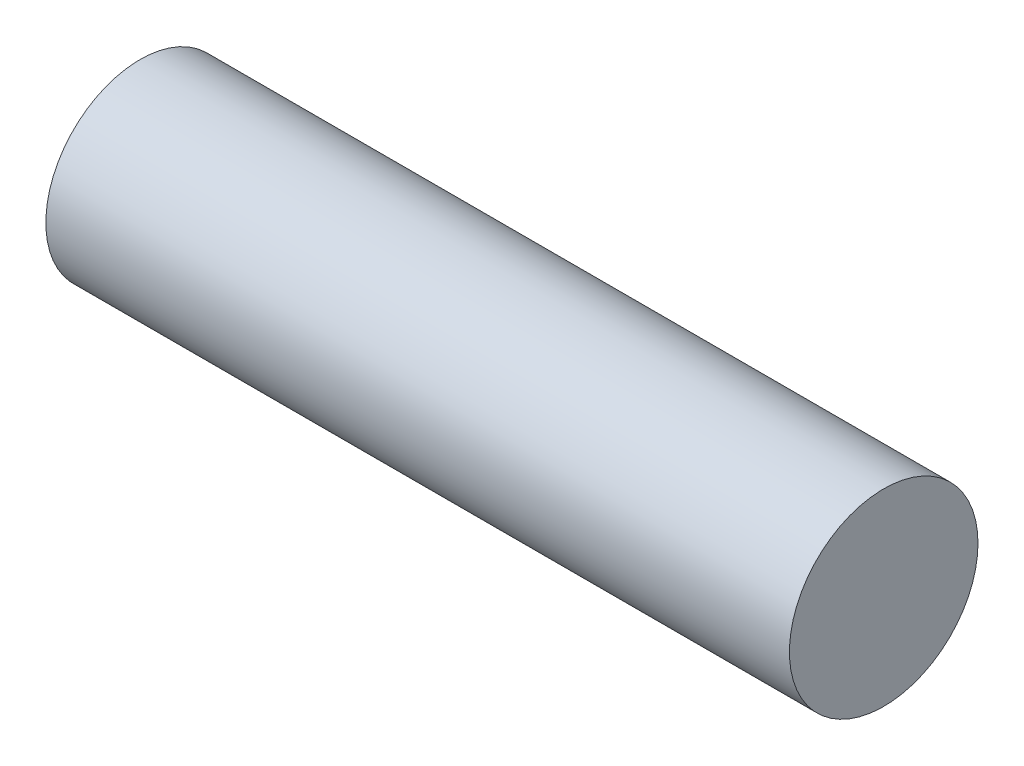
ISO-10303-21;
HEADER;
FILE_DESCRIPTION(('STEP AP214'),'2;1');
FILE_NAME('part.step','',(''),(''),'','','');
FILE_SCHEMA(('AUTOMOTIVE_DESIGN { 1 0 10303 214 1 1 1 1 }'));
ENDSEC;
DATA;
#1=APPLICATION_CONTEXT('core data for automotive mechanical design processes');
#2=APPLICATION_PROTOCOL_DEFINITION('international standard','automotive_design',2000,#1);
#3=PRODUCT_CONTEXT('',#1,'mechanical');
#4=PRODUCT('Part','Part','',(#3));
#5=PRODUCT_RELATED_PRODUCT_CATEGORY('part','',(#4));
#6=PRODUCT_DEFINITION_FORMATION('','',#4);
#7=PRODUCT_DEFINITION_CONTEXT('part definition',#1,'design');
#8=PRODUCT_DEFINITION('design','',#6,#7);
#9=PRODUCT_DEFINITION_SHAPE('','',#8);
#10=(LENGTH_UNIT() NAMED_UNIT(*) SI_UNIT(.MILLI.,.METRE.));
#11=(NAMED_UNIT(*) PLANE_ANGLE_UNIT() SI_UNIT($,.RADIAN.));
#12=(NAMED_UNIT(*) SI_UNIT($,.STERADIAN.) SOLID_ANGLE_UNIT());
#13=UNCERTAINTY_MEASURE_WITH_UNIT(LENGTH_MEASURE(1.E-05),#10,'distance_accuracy_value','');
#14=(GEOMETRIC_REPRESENTATION_CONTEXT(3) GLOBAL_UNCERTAINTY_ASSIGNED_CONTEXT((#13)) GLOBAL_UNIT_ASSIGNED_CONTEXT((#10,
#11,#12)) REPRESENTATION_CONTEXT('',''));
#15=CARTESIAN_POINT('',(0.,0.,0.));
#16=DIRECTION('',(0.,0.,1.));
#17=DIRECTION('',(1.,0.,0.));
#18=AXIS2_PLACEMENT_3D('',#15,#16,#17);
#19=CARTESIAN_POINT('',(125.,127.939295122889,166.503843588376));
#20=DIRECTION('',(-1.,0.,0.));
#21=DIRECTION('',(0.,0.,1.));
#22=AXIS2_PLACEMENT_3D('',#19,#20,#21);
#23=CYLINDRICAL_SURFACE('',#22,31.6993985263398);
#24=CARTESIAN_POINT('',(125.,127.939295122889,166.503843588376));
#25=DIRECTION('',(1.,0.,0.));
#26=DIRECTION('',(0.,0.,-1.));
#27=AXIS2_PLACEMENT_3D('',#24,#25,#26);
#28=CIRCLE('',#27,31.6993985263398);
#29=CARTESIAN_POINT('',(125.,127.939295122889,134.804445062036));
#30=VERTEX_POINT('',#29);
#31=EDGE_CURVE('E10',#30,#30,#28,.T.);
#32=ORIENTED_EDGE('',*,*,#31,.F.);
#33=EDGE_LOOP('',(#32));
#34=FACE_BOUND('',#33,.T.);
#35=CARTESIAN_POINT('',(-125.,127.939295122889,166.503843588376));
#36=DIRECTION('',(1.,0.,0.));
#37=DIRECTION('',(0.,0.,-1.));
#38=AXIS2_PLACEMENT_3D('',#35,#36,#37);
#39=CIRCLE('',#38,31.6993985263398);
#40=CARTESIAN_POINT('',(-125.,127.939295122889,134.804445062036));
#41=VERTEX_POINT('',#40);
#42=EDGE_CURVE('E36',#41,#41,#39,.T.);
#43=ORIENTED_EDGE('',*,*,#42,.T.);
#44=EDGE_LOOP('',(#43));
#45=FACE_BOUND('',#44,.T.);
#46=ADVANCED_FACE('F33',(#34,#45),#23,.T.);
#47=CARTESIAN_POINT('',(125.,127.939295122889,166.503843588376));
#48=DIRECTION('',(1.,0.,0.));
#49=DIRECTION('',(0.,0.,-1.));
#50=AXIS2_PLACEMENT_3D('',#47,#48,#49);
#51=PLANE('',#50);
#52=ORIENTED_EDGE('',*,*,#31,.T.);
#53=EDGE_LOOP('',(#52));
#54=FACE_BOUND('',#53,.T.);
#55=ADVANCED_FACE('F48',(#54),#51,.T.);
#56=CARTESIAN_POINT('',(-125.,127.939295122889,166.503843588376));
#57=DIRECTION('',(1.,0.,0.));
#58=DIRECTION('',(0.,0.,-1.));
#59=AXIS2_PLACEMENT_3D('',#56,#57,#58);
#60=PLANE('',#59);
#61=ORIENTED_EDGE('',*,*,#42,.F.);
#62=EDGE_LOOP('',(#61));
#63=FACE_BOUND('',#62,.T.);
#64=ADVANCED_FACE('F46',(#63),#60,.F.);
#65=CLOSED_SHELL('',(#46,#55,#64));
#66=MANIFOLD_SOLID_BREP('B2',#65);
#67=ADVANCED_BREP_SHAPE_REPRESENTATION('',(#18,#66),#14);
#68=SHAPE_DEFINITION_REPRESENTATION(#9,#67);
ENDSEC;
END-ISO-10303-21;
